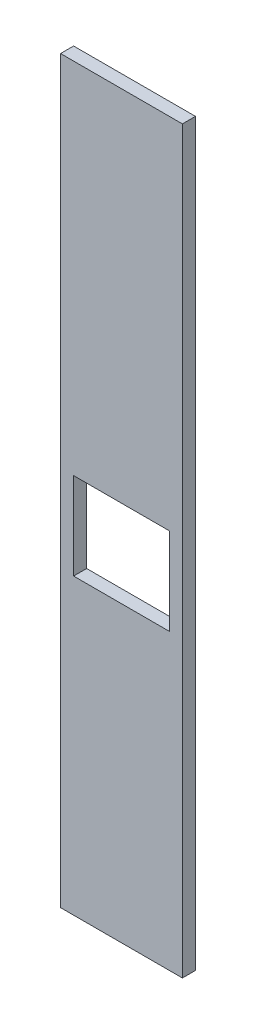
ISO-10303-21;
HEADER;
FILE_DESCRIPTION(('STEP AP214'),'2;1');
FILE_NAME('part.step','',(''),(''),'','','');
FILE_SCHEMA(('AUTOMOTIVE_DESIGN { 1 0 10303 214 1 1 1 1 }'));
ENDSEC;
DATA;
#1=APPLICATION_CONTEXT('core data for automotive mechanical design processes');
#2=APPLICATION_PROTOCOL_DEFINITION('international standard','automotive_design',2000,#1);
#3=PRODUCT_CONTEXT('',#1,'mechanical');
#4=PRODUCT('Part','Part','',(#3));
#5=PRODUCT_RELATED_PRODUCT_CATEGORY('part','',(#4));
#6=PRODUCT_DEFINITION_FORMATION('','',#4);
#7=PRODUCT_DEFINITION_CONTEXT('part definition',#1,'design');
#8=PRODUCT_DEFINITION('design','',#6,#7);
#9=PRODUCT_DEFINITION_SHAPE('','',#8);
#10=(LENGTH_UNIT() NAMED_UNIT(*) SI_UNIT(.MILLI.,.METRE.));
#11=(NAMED_UNIT(*) PLANE_ANGLE_UNIT() SI_UNIT($,.RADIAN.));
#12=(NAMED_UNIT(*) SI_UNIT($,.STERADIAN.) SOLID_ANGLE_UNIT());
#13=UNCERTAINTY_MEASURE_WITH_UNIT(LENGTH_MEASURE(1.E-05),#10,'distance_accuracy_value','');
#14=(GEOMETRIC_REPRESENTATION_CONTEXT(3) GLOBAL_UNCERTAINTY_ASSIGNED_CONTEXT((#13)) GLOBAL_UNIT_ASSIGNED_CONTEXT((#10,
#11,#12)) REPRESENTATION_CONTEXT('',''));
#15=CARTESIAN_POINT('',(0.,0.,0.));
#16=DIRECTION('',(0.,0.,1.));
#17=DIRECTION('',(1.,0.,0.));
#18=AXIS2_PLACEMENT_3D('',#15,#16,#17);
#19=CARTESIAN_POINT('',(0.,0.,6.));
#20=DIRECTION('',(0.,0.,1.));
#21=DIRECTION('',(1.,0.,0.));
#22=AXIS2_PLACEMENT_3D('',#19,#20,#21);
#23=PLANE('',#22);
#24=DIRECTION('',(0.,1.,0.));
#25=VECTOR('',#24,1.);
#26=CARTESIAN_POINT('',(0.,0.,6.));
#27=LINE('',#26,#25);
#28=CARTESIAN_POINT('',(0.,0.,6.));
#29=VERTEX_POINT('',#28);
#30=CARTESIAN_POINT('',(0.,340.,6.));
#31=VERTEX_POINT('',#30);
#32=EDGE_CURVE('E134',#29,#31,#27,.T.);
#33=ORIENTED_EDGE('',*,*,#32,.T.);
#34=DIRECTION('',(-1.,0.,0.));
#35=VECTOR('',#34,1.);
#36=CARTESIAN_POINT('',(0.,340.,6.));
#37=LINE('',#36,#35);
#38=CARTESIAN_POINT('',(-56.,340.,6.));
#39=VERTEX_POINT('',#38);
#40=EDGE_CURVE('E137',#31,#39,#37,.T.);
#41=ORIENTED_EDGE('',*,*,#40,.T.);
#42=DIRECTION('',(0.,-1.,0.));
#43=VECTOR('',#42,1.);
#44=CARTESIAN_POINT('',(-56.,0.,6.));
#45=LINE('',#44,#43);
#46=CARTESIAN_POINT('',(-56.,0.,6.));
#47=VERTEX_POINT('',#46);
#48=EDGE_CURVE('E140',#39,#47,#45,.T.);
#49=ORIENTED_EDGE('',*,*,#48,.T.);
#50=DIRECTION('',(1.,0.,0.));
#51=VECTOR('',#50,1.);
#52=CARTESIAN_POINT('',(0.,0.,6.));
#53=LINE('',#52,#51);
#54=EDGE_CURVE('E142',#47,#29,#53,.T.);
#55=ORIENTED_EDGE('',*,*,#54,.T.);
#56=EDGE_LOOP('',(#33,#41,#49,#55));
#57=FACE_BOUND('',#56,.T.);
#58=DIRECTION('',(-1.,0.,0.));
#59=VECTOR('',#58,1.);
#60=CARTESIAN_POINT('',(-6.,175.,6.));
#61=LINE('',#60,#59);
#62=CARTESIAN_POINT('',(-6.,175.,6.));
#63=VERTEX_POINT('',#62);
#64=CARTESIAN_POINT('',(-50.,175.,6.));
#65=VERTEX_POINT('',#64);
#66=EDGE_CURVE('E106',#63,#65,#61,.T.);
#67=ORIENTED_EDGE('',*,*,#66,.F.);
#68=DIRECTION('',(0.,1.,0.));
#69=VECTOR('',#68,1.);
#70=CARTESIAN_POINT('',(-6.,135.,6.));
#71=LINE('',#70,#69);
#72=CARTESIAN_POINT('',(-6.,135.,6.));
#73=VERTEX_POINT('',#72);
#74=EDGE_CURVE('E98',#73,#63,#71,.T.);
#75=ORIENTED_EDGE('',*,*,#74,.F.);
#76=DIRECTION('',(1.,0.,0.));
#77=VECTOR('',#76,1.);
#78=CARTESIAN_POINT('',(-6.,135.,6.));
#79=LINE('',#78,#77);
#80=CARTESIAN_POINT('',(-50.,135.,6.));
#81=VERTEX_POINT('',#80);
#82=EDGE_CURVE('E120',#81,#73,#79,.T.);
#83=ORIENTED_EDGE('',*,*,#82,.F.);
#84=DIRECTION('',(0.,-1.,0.));
#85=VECTOR('',#84,1.);
#86=CARTESIAN_POINT('',(-50.,135.,6.));
#87=LINE('',#86,#85);
#88=EDGE_CURVE('E118',#65,#81,#87,.T.);
#89=ORIENTED_EDGE('',*,*,#88,.F.);
#90=EDGE_LOOP('',(#67,#75,#83,#89));
#91=FACE_BOUND('',#90,.T.);
#92=ADVANCED_FACE('F33',(#57,#91),#23,.T.);
#93=CARTESIAN_POINT('',(0.,0.,0.));
#94=DIRECTION('',(0.,0.,1.));
#95=DIRECTION('',(1.,0.,0.));
#96=AXIS2_PLACEMENT_3D('',#93,#94,#95);
#97=PLANE('',#96);
#98=DIRECTION('',(0.,1.,0.));
#99=VECTOR('',#98,1.);
#100=CARTESIAN_POINT('',(0.,0.,0.));
#101=LINE('',#100,#99);
#102=CARTESIAN_POINT('',(0.,0.,0.));
#103=VERTEX_POINT('',#102);
#104=CARTESIAN_POINT('',(0.,340.,0.));
#105=VERTEX_POINT('',#104);
#106=EDGE_CURVE('E114',#103,#105,#101,.T.);
#107=ORIENTED_EDGE('',*,*,#106,.F.);
#108=DIRECTION('',(1.,0.,0.));
#109=VECTOR('',#108,1.);
#110=CARTESIAN_POINT('',(0.,0.,0.));
#111=LINE('',#110,#109);
#112=CARTESIAN_POINT('',(-56.,0.,0.));
#113=VERTEX_POINT('',#112);
#114=EDGE_CURVE('E138',#113,#103,#111,.T.);
#115=ORIENTED_EDGE('',*,*,#114,.F.);
#116=DIRECTION('',(0.,-1.,0.));
#117=VECTOR('',#116,1.);
#118=CARTESIAN_POINT('',(-56.,0.,0.));
#119=LINE('',#118,#117);
#120=CARTESIAN_POINT('',(-56.,340.,0.));
#121=VERTEX_POINT('',#120);
#122=EDGE_CURVE('E149',#121,#113,#119,.T.);
#123=ORIENTED_EDGE('',*,*,#122,.F.);
#124=DIRECTION('',(-1.,0.,0.));
#125=VECTOR('',#124,1.);
#126=CARTESIAN_POINT('',(0.,340.,0.));
#127=LINE('',#126,#125);
#128=EDGE_CURVE('E147',#105,#121,#127,.T.);
#129=ORIENTED_EDGE('',*,*,#128,.F.);
#130=EDGE_LOOP('',(#107,#115,#123,#129));
#131=FACE_BOUND('',#130,.T.);
#132=DIRECTION('',(0.,1.,0.));
#133=VECTOR('',#132,1.);
#134=CARTESIAN_POINT('',(-6.,135.,0.));
#135=LINE('',#134,#133);
#136=CARTESIAN_POINT('',(-6.,135.,0.));
#137=VERTEX_POINT('',#136);
#138=CARTESIAN_POINT('',(-6.,175.,0.));
#139=VERTEX_POINT('',#138);
#140=EDGE_CURVE('E56',#137,#139,#135,.T.);
#141=ORIENTED_EDGE('',*,*,#140,.T.);
#142=DIRECTION('',(-1.,0.,0.));
#143=VECTOR('',#142,1.);
#144=CARTESIAN_POINT('',(-6.,175.,0.));
#145=LINE('',#144,#143);
#146=CARTESIAN_POINT('',(-50.,175.,0.));
#147=VERTEX_POINT('',#146);
#148=EDGE_CURVE('E113',#139,#147,#145,.T.);
#149=ORIENTED_EDGE('',*,*,#148,.T.);
#150=DIRECTION('',(0.,-1.,0.));
#151=VECTOR('',#150,1.);
#152=CARTESIAN_POINT('',(-50.,135.,0.));
#153=LINE('',#152,#151);
#154=CARTESIAN_POINT('',(-50.,135.,0.));
#155=VERTEX_POINT('',#154);
#156=EDGE_CURVE('E126',#147,#155,#153,.T.);
#157=ORIENTED_EDGE('',*,*,#156,.T.);
#158=DIRECTION('',(1.,0.,0.));
#159=VECTOR('',#158,1.);
#160=CARTESIAN_POINT('',(-6.,135.,0.));
#161=LINE('',#160,#159);
#162=EDGE_CURVE('E107',#155,#137,#161,.T.);
#163=ORIENTED_EDGE('',*,*,#162,.T.);
#164=EDGE_LOOP('',(#141,#149,#157,#163));
#165=FACE_BOUND('',#164,.T.);
#166=ADVANCED_FACE('F167',(#131,#165),#97,.F.);
#167=CARTESIAN_POINT('',(0.,0.,6.));
#168=DIRECTION('',(-1.,0.,0.));
#169=DIRECTION('',(0.,0.,1.));
#170=AXIS2_PLACEMENT_3D('',#167,#168,#169);
#171=PLANE('',#170);
#172=ORIENTED_EDGE('',*,*,#106,.T.);
#173=DIRECTION('',(0.,0.,-1.));
#174=VECTOR('',#173,1.);
#175=CARTESIAN_POINT('',(0.,340.,6.));
#176=LINE('',#175,#174);
#177=EDGE_CURVE('E11',#31,#105,#176,.T.);
#178=ORIENTED_EDGE('',*,*,#177,.F.);
#179=ORIENTED_EDGE('',*,*,#32,.F.);
#180=DIRECTION('',(0.,0.,-1.));
#181=VECTOR('',#180,1.);
#182=CARTESIAN_POINT('',(0.,0.,6.));
#183=LINE('',#182,#181);
#184=EDGE_CURVE('E144',#29,#103,#183,.T.);
#185=ORIENTED_EDGE('',*,*,#184,.T.);
#186=EDGE_LOOP('',(#172,#178,#179,#185));
#187=FACE_BOUND('',#186,.T.);
#188=ADVANCED_FACE('F35',(#187),#171,.F.);
#189=CARTESIAN_POINT('',(0.,340.,6.));
#190=DIRECTION('',(0.,-1.,0.));
#191=DIRECTION('',(0.,0.,-1.));
#192=AXIS2_PLACEMENT_3D('',#189,#190,#191);
#193=PLANE('',#192);
#194=ORIENTED_EDGE('',*,*,#128,.T.);
#195=DIRECTION('',(0.,0.,-1.));
#196=VECTOR('',#195,1.);
#197=CARTESIAN_POINT('',(-56.,340.,6.));
#198=LINE('',#197,#196);
#199=EDGE_CURVE('E41',#39,#121,#198,.T.);
#200=ORIENTED_EDGE('',*,*,#199,.F.);
#201=ORIENTED_EDGE('',*,*,#40,.F.);
#202=ORIENTED_EDGE('',*,*,#177,.T.);
#203=EDGE_LOOP('',(#194,#200,#201,#202));
#204=FACE_BOUND('',#203,.T.);
#205=ADVANCED_FACE('F177',(#204),#193,.F.);
#206=CARTESIAN_POINT('',(-56.,0.,6.));
#207=DIRECTION('',(1.,0.,0.));
#208=DIRECTION('',(0.,1.,0.));
#209=AXIS2_PLACEMENT_3D('',#206,#207,#208);
#210=PLANE('',#209);
#211=ORIENTED_EDGE('',*,*,#122,.T.);
#212=DIRECTION('',(0.,0.,-1.));
#213=VECTOR('',#212,1.);
#214=CARTESIAN_POINT('',(-56.,0.,6.));
#215=LINE('',#214,#213);
#216=EDGE_CURVE('E154',#47,#113,#215,.T.);
#217=ORIENTED_EDGE('',*,*,#216,.F.);
#218=ORIENTED_EDGE('',*,*,#48,.F.);
#219=ORIENTED_EDGE('',*,*,#199,.T.);
#220=EDGE_LOOP('',(#211,#217,#218,#219));
#221=FACE_BOUND('',#220,.T.);
#222=ADVANCED_FACE('F161',(#221),#210,.F.);
#223=CARTESIAN_POINT('',(0.,0.,6.));
#224=DIRECTION('',(0.,1.,0.));
#225=DIRECTION('',(-1.,0.,0.));
#226=AXIS2_PLACEMENT_3D('',#223,#224,#225);
#227=PLANE('',#226);
#228=ORIENTED_EDGE('',*,*,#114,.T.);
#229=ORIENTED_EDGE('',*,*,#184,.F.);
#230=ORIENTED_EDGE('',*,*,#54,.F.);
#231=ORIENTED_EDGE('',*,*,#216,.T.);
#232=EDGE_LOOP('',(#228,#229,#230,#231));
#233=FACE_BOUND('',#232,.T.);
#234=ADVANCED_FACE('F171',(#233),#227,.F.);
#235=CARTESIAN_POINT('',(-6.,135.,6.));
#236=DIRECTION('',(-1.,0.,0.));
#237=DIRECTION('',(0.,0.,1.));
#238=AXIS2_PLACEMENT_3D('',#235,#236,#237);
#239=PLANE('',#238);
#240=ORIENTED_EDGE('',*,*,#140,.F.);
#241=DIRECTION('',(0.,0.,-1.));
#242=VECTOR('',#241,1.);
#243=CARTESIAN_POINT('',(-6.,135.,6.));
#244=LINE('',#243,#242);
#245=EDGE_CURVE('E102',#73,#137,#244,.T.);
#246=ORIENTED_EDGE('',*,*,#245,.F.);
#247=ORIENTED_EDGE('',*,*,#74,.T.);
#248=DIRECTION('',(0.,0.,-1.));
#249=VECTOR('',#248,1.);
#250=CARTESIAN_POINT('',(-6.,175.,6.));
#251=LINE('',#250,#249);
#252=EDGE_CURVE('E101',#63,#139,#251,.T.);
#253=ORIENTED_EDGE('',*,*,#252,.T.);
#254=EDGE_LOOP('',(#240,#246,#247,#253));
#255=FACE_BOUND('',#254,.T.);
#256=ADVANCED_FACE('F100',(#255),#239,.T.);
#257=CARTESIAN_POINT('',(-6.,175.,6.));
#258=DIRECTION('',(0.,-1.,0.));
#259=DIRECTION('',(0.,0.,-1.));
#260=AXIS2_PLACEMENT_3D('',#257,#258,#259);
#261=PLANE('',#260);
#262=ORIENTED_EDGE('',*,*,#148,.F.);
#263=ORIENTED_EDGE('',*,*,#252,.F.);
#264=ORIENTED_EDGE('',*,*,#66,.T.);
#265=DIRECTION('',(0.,0.,-1.));
#266=VECTOR('',#265,1.);
#267=CARTESIAN_POINT('',(-50.,175.,6.));
#268=LINE('',#267,#266);
#269=EDGE_CURVE('E115',#65,#147,#268,.T.);
#270=ORIENTED_EDGE('',*,*,#269,.T.);
#271=EDGE_LOOP('',(#262,#263,#264,#270));
#272=FACE_BOUND('',#271,.T.);
#273=ADVANCED_FACE('F110',(#272),#261,.T.);
#274=CARTESIAN_POINT('',(-50.,135.,6.));
#275=DIRECTION('',(1.,0.,0.));
#276=DIRECTION('',(0.,1.,0.));
#277=AXIS2_PLACEMENT_3D('',#274,#275,#276);
#278=PLANE('',#277);
#279=ORIENTED_EDGE('',*,*,#156,.F.);
#280=ORIENTED_EDGE('',*,*,#269,.F.);
#281=ORIENTED_EDGE('',*,*,#88,.T.);
#282=DIRECTION('',(0.,0.,-1.));
#283=VECTOR('',#282,1.);
#284=CARTESIAN_POINT('',(-50.,135.,6.));
#285=LINE('',#284,#283);
#286=EDGE_CURVE('E48',#81,#155,#285,.T.);
#287=ORIENTED_EDGE('',*,*,#286,.T.);
#288=EDGE_LOOP('',(#279,#280,#281,#287));
#289=FACE_BOUND('',#288,.T.);
#290=ADVANCED_FACE('F200',(#289),#278,.T.);
#291=CARTESIAN_POINT('',(-6.,135.,6.));
#292=DIRECTION('',(0.,1.,0.));
#293=DIRECTION('',(0.,0.,1.));
#294=AXIS2_PLACEMENT_3D('',#291,#292,#293);
#295=PLANE('',#294);
#296=ORIENTED_EDGE('',*,*,#162,.F.);
#297=ORIENTED_EDGE('',*,*,#286,.F.);
#298=ORIENTED_EDGE('',*,*,#82,.T.);
#299=ORIENTED_EDGE('',*,*,#245,.T.);
#300=EDGE_LOOP('',(#296,#297,#298,#299));
#301=FACE_BOUND('',#300,.T.);
#302=ADVANCED_FACE('F204',(#301),#295,.T.);
#303=CLOSED_SHELL('',(#92,#166,#188,#205,#222,#234,#256,#273,#290,#302));
#304=MANIFOLD_SOLID_BREP('B2',#303);
#305=ADVANCED_BREP_SHAPE_REPRESENTATION('',(#18,#304),#14);
#306=SHAPE_DEFINITION_REPRESENTATION(#9,#305);
ENDSEC;
END-ISO-10303-21;
